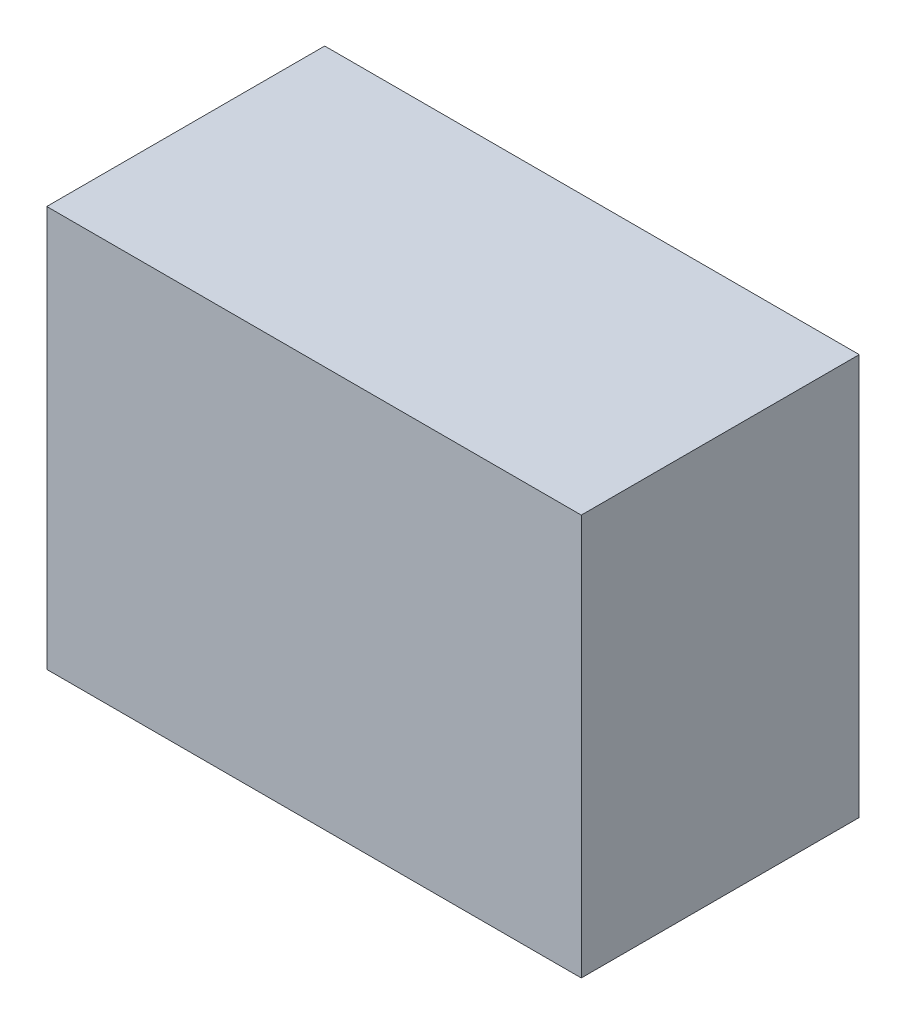
ISO-10303-21;
HEADER;
FILE_DESCRIPTION(('STEP AP214'),'2;1');
FILE_NAME('part.step','',(''),(''),'','','');
FILE_SCHEMA(('AUTOMOTIVE_DESIGN { 1 0 10303 214 1 1 1 1 }'));
ENDSEC;
DATA;
#1=APPLICATION_CONTEXT('core data for automotive mechanical design processes');
#2=APPLICATION_PROTOCOL_DEFINITION('international standard','automotive_design',2000,#1);
#3=PRODUCT_CONTEXT('',#1,'mechanical');
#4=PRODUCT('Part','Part','',(#3));
#5=PRODUCT_RELATED_PRODUCT_CATEGORY('part','',(#4));
#6=PRODUCT_DEFINITION_FORMATION('','',#4);
#7=PRODUCT_DEFINITION_CONTEXT('part definition',#1,'design');
#8=PRODUCT_DEFINITION('design','',#6,#7);
#9=PRODUCT_DEFINITION_SHAPE('','',#8);
#10=(LENGTH_UNIT() NAMED_UNIT(*) SI_UNIT(.MILLI.,.METRE.));
#11=(NAMED_UNIT(*) PLANE_ANGLE_UNIT() SI_UNIT($,.RADIAN.));
#12=(NAMED_UNIT(*) SI_UNIT($,.STERADIAN.) SOLID_ANGLE_UNIT());
#13=UNCERTAINTY_MEASURE_WITH_UNIT(LENGTH_MEASURE(1.E-05),#10,'distance_accuracy_value','');
#14=(GEOMETRIC_REPRESENTATION_CONTEXT(3) GLOBAL_UNCERTAINTY_ASSIGNED_CONTEXT((#13)) GLOBAL_UNIT_ASSIGNED_CONTEXT((#10,
#11,#12)) REPRESENTATION_CONTEXT('',''));
#15=CARTESIAN_POINT('',(0.,0.,0.));
#16=DIRECTION('',(0.,0.,1.));
#17=DIRECTION('',(1.,0.,0.));
#18=AXIS2_PLACEMENT_3D('',#15,#16,#17);
#19=CARTESIAN_POINT('',(10.,7.5,10.4));
#20=DIRECTION('',(-1.,0.,0.));
#21=DIRECTION('',(0.,-1.,0.));
#22=AXIS2_PLACEMENT_3D('',#19,#20,#21);
#23=PLANE('',#22);
#24=DIRECTION('',(0.,1.,0.));
#25=VECTOR('',#24,1.);
#26=CARTESIAN_POINT('',(10.,7.5,0.));
#27=LINE('',#26,#25);
#28=CARTESIAN_POINT('',(10.,-7.5,0.));
#29=VERTEX_POINT('',#28);
#30=CARTESIAN_POINT('',(10.,7.5,0.));
#31=VERTEX_POINT('',#30);
#32=EDGE_CURVE('E107',#29,#31,#27,.T.);
#33=ORIENTED_EDGE('',*,*,#32,.T.);
#34=DIRECTION('',(0.,0.,-1.));
#35=VECTOR('',#34,1.);
#36=CARTESIAN_POINT('',(10.,7.5,10.4));
#37=LINE('',#36,#35);
#38=CARTESIAN_POINT('',(10.,7.5,10.4));
#39=VERTEX_POINT('',#38);
#40=EDGE_CURVE('E11',#39,#31,#37,.T.);
#41=ORIENTED_EDGE('',*,*,#40,.F.);
#42=DIRECTION('',(0.,1.,0.));
#43=VECTOR('',#42,1.);
#44=CARTESIAN_POINT('',(10.,7.5,10.4));
#45=LINE('',#44,#43);
#46=CARTESIAN_POINT('',(10.,-7.5,10.4));
#47=VERTEX_POINT('',#46);
#48=EDGE_CURVE('E91',#47,#39,#45,.T.);
#49=ORIENTED_EDGE('',*,*,#48,.F.);
#50=DIRECTION('',(0.,0.,-1.));
#51=VECTOR('',#50,1.);
#52=CARTESIAN_POINT('',(10.,-7.5,10.4));
#53=LINE('',#52,#51);
#54=EDGE_CURVE('E103',#47,#29,#53,.T.);
#55=ORIENTED_EDGE('',*,*,#54,.T.);
#56=EDGE_LOOP('',(#33,#41,#49,#55));
#57=FACE_BOUND('',#56,.T.);
#58=ADVANCED_FACE('F39',(#57),#23,.F.);
#59=CARTESIAN_POINT('',(-10.,7.5,10.4));
#60=DIRECTION('',(0.,-1.,0.));
#61=DIRECTION('',(0.,0.,-1.));
#62=AXIS2_PLACEMENT_3D('',#59,#60,#61);
#63=PLANE('',#62);
#64=DIRECTION('',(-1.,0.,0.));
#65=VECTOR('',#64,1.);
#66=CARTESIAN_POINT('',(-10.,7.5,0.));
#67=LINE('',#66,#65);
#68=CARTESIAN_POINT('',(-10.,7.5,0.));
#69=VERTEX_POINT('',#68);
#70=EDGE_CURVE('E96',#31,#69,#67,.T.);
#71=ORIENTED_EDGE('',*,*,#70,.T.);
#72=DIRECTION('',(0.,0.,-1.));
#73=VECTOR('',#72,1.);
#74=CARTESIAN_POINT('',(-10.,7.5,10.4));
#75=LINE('',#74,#73);
#76=CARTESIAN_POINT('',(-10.,7.5,10.4));
#77=VERTEX_POINT('',#76);
#78=EDGE_CURVE('E48',#77,#69,#75,.T.);
#79=ORIENTED_EDGE('',*,*,#78,.F.);
#80=DIRECTION('',(-1.,0.,0.));
#81=VECTOR('',#80,1.);
#82=CARTESIAN_POINT('',(-10.,7.5,10.4));
#83=LINE('',#82,#81);
#84=EDGE_CURVE('E86',#39,#77,#83,.T.);
#85=ORIENTED_EDGE('',*,*,#84,.F.);
#86=ORIENTED_EDGE('',*,*,#40,.T.);
#87=EDGE_LOOP('',(#71,#79,#85,#86));
#88=FACE_BOUND('',#87,.T.);
#89=ADVANCED_FACE('F95',(#88),#63,.F.);
#90=CARTESIAN_POINT('',(-10.,7.5,10.4));
#91=DIRECTION('',(1.,0.,0.));
#92=DIRECTION('',(0.,1.,0.));
#93=AXIS2_PLACEMENT_3D('',#90,#91,#92);
#94=PLANE('',#93);
#95=DIRECTION('',(0.,-1.,0.));
#96=VECTOR('',#95,1.);
#97=CARTESIAN_POINT('',(-10.,7.5,0.));
#98=LINE('',#97,#96);
#99=CARTESIAN_POINT('',(-10.,-7.5,0.));
#100=VERTEX_POINT('',#99);
#101=EDGE_CURVE('E73',#69,#100,#98,.T.);
#102=ORIENTED_EDGE('',*,*,#101,.T.);
#103=DIRECTION('',(0.,0.,-1.));
#104=VECTOR('',#103,1.);
#105=CARTESIAN_POINT('',(-10.,-7.5,10.4));
#106=LINE('',#105,#104);
#107=CARTESIAN_POINT('',(-10.,-7.5,10.4));
#108=VERTEX_POINT('',#107);
#109=EDGE_CURVE('E98',#108,#100,#106,.T.);
#110=ORIENTED_EDGE('',*,*,#109,.F.);
#111=DIRECTION('',(0.,-1.,0.));
#112=VECTOR('',#111,1.);
#113=CARTESIAN_POINT('',(-10.,7.5,10.4));
#114=LINE('',#113,#112);
#115=EDGE_CURVE('E89',#77,#108,#114,.T.);
#116=ORIENTED_EDGE('',*,*,#115,.F.);
#117=ORIENTED_EDGE('',*,*,#78,.T.);
#118=EDGE_LOOP('',(#102,#110,#116,#117));
#119=FACE_BOUND('',#118,.T.);
#120=ADVANCED_FACE('F99',(#119),#94,.F.);
#121=CARTESIAN_POINT('',(-10.,-7.5,10.4));
#122=DIRECTION('',(0.,1.,0.));
#123=DIRECTION('',(0.,0.,1.));
#124=AXIS2_PLACEMENT_3D('',#121,#122,#123);
#125=PLANE('',#124);
#126=DIRECTION('',(1.,0.,0.));
#127=VECTOR('',#126,1.);
#128=CARTESIAN_POINT('',(-10.,-7.5,0.));
#129=LINE('',#128,#127);
#130=EDGE_CURVE('E79',#100,#29,#129,.T.);
#131=ORIENTED_EDGE('',*,*,#130,.T.);
#132=ORIENTED_EDGE('',*,*,#54,.F.);
#133=DIRECTION('',(1.,0.,0.));
#134=VECTOR('',#133,1.);
#135=CARTESIAN_POINT('',(-10.,-7.5,10.4));
#136=LINE('',#135,#134);
#137=EDGE_CURVE('E56',#108,#47,#136,.T.);
#138=ORIENTED_EDGE('',*,*,#137,.F.);
#139=ORIENTED_EDGE('',*,*,#109,.T.);
#140=EDGE_LOOP('',(#131,#132,#138,#139));
#141=FACE_BOUND('',#140,.T.);
#142=ADVANCED_FACE('F120',(#141),#125,.F.);
#143=CARTESIAN_POINT('',(0.,0.,10.4));
#144=DIRECTION('',(0.,0.,1.));
#145=DIRECTION('',(1.,0.,0.));
#146=AXIS2_PLACEMENT_3D('',#143,#144,#145);
#147=PLANE('',#146);
#148=ORIENTED_EDGE('',*,*,#48,.T.);
#149=ORIENTED_EDGE('',*,*,#84,.T.);
#150=ORIENTED_EDGE('',*,*,#115,.T.);
#151=ORIENTED_EDGE('',*,*,#137,.T.);
#152=EDGE_LOOP('',(#148,#149,#150,#151));
#153=FACE_BOUND('',#152,.T.);
#154=ADVANCED_FACE('F87',(#153),#147,.T.);
#155=CARTESIAN_POINT('',(0.,0.,0.));
#156=DIRECTION('',(0.,0.,1.));
#157=DIRECTION('',(1.,0.,0.));
#158=AXIS2_PLACEMENT_3D('',#155,#156,#157);
#159=PLANE('',#158);
#160=ORIENTED_EDGE('',*,*,#32,.F.);
#161=ORIENTED_EDGE('',*,*,#130,.F.);
#162=ORIENTED_EDGE('',*,*,#101,.F.);
#163=ORIENTED_EDGE('',*,*,#70,.F.);
#164=EDGE_LOOP('',(#160,#161,#162,#163));
#165=FACE_BOUND('',#164,.T.);
#166=ADVANCED_FACE('F123',(#165),#159,.F.);
#167=CLOSED_SHELL('',(#58,#89,#120,#142,#154,#166));
#168=MANIFOLD_SOLID_BREP('B2',#167);
#169=ADVANCED_BREP_SHAPE_REPRESENTATION('',(#18,#168),#14);
#170=SHAPE_DEFINITION_REPRESENTATION(#9,#169);
ENDSEC;
END-ISO-10303-21;
